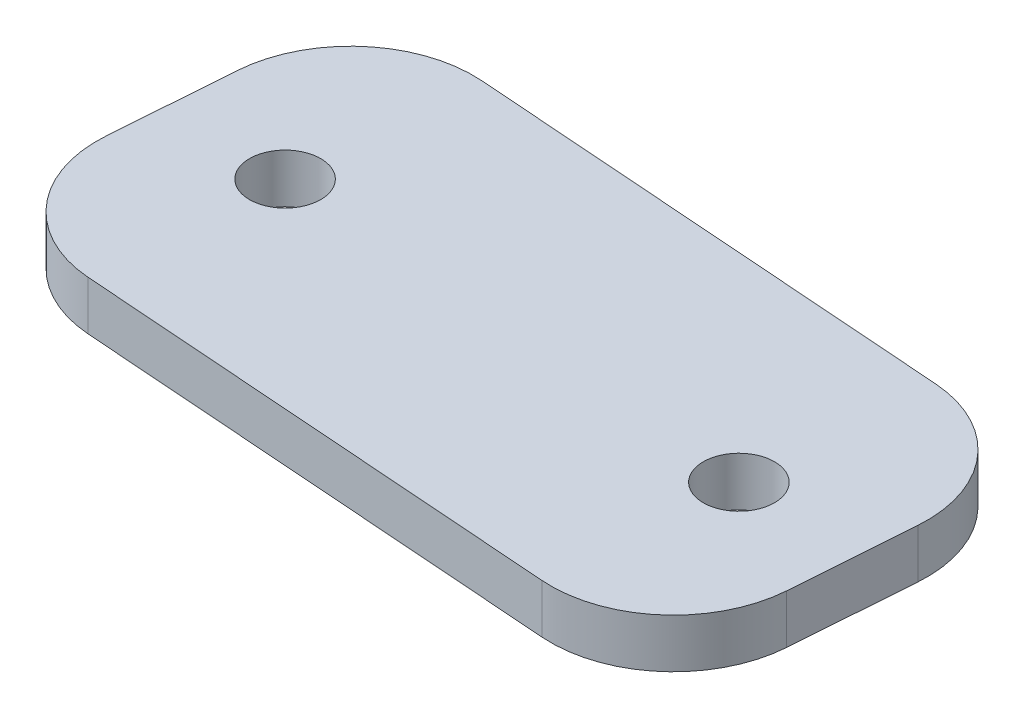
ISO-10303-21;
HEADER;
FILE_DESCRIPTION(('STEP AP214'),'2;1');
FILE_NAME('part.step','',(''),(''),'','','');
FILE_SCHEMA(('AUTOMOTIVE_DESIGN { 1 0 10303 214 1 1 1 1 }'));
ENDSEC;
DATA;
#1=APPLICATION_CONTEXT('core data for automotive mechanical design processes');
#2=APPLICATION_PROTOCOL_DEFINITION('international standard','automotive_design',2000,#1);
#3=PRODUCT_CONTEXT('',#1,'mechanical');
#4=PRODUCT('Part','Part','',(#3));
#5=PRODUCT_RELATED_PRODUCT_CATEGORY('part','',(#4));
#6=PRODUCT_DEFINITION_FORMATION('','',#4);
#7=PRODUCT_DEFINITION_CONTEXT('part definition',#1,'design');
#8=PRODUCT_DEFINITION('design','',#6,#7);
#9=PRODUCT_DEFINITION_SHAPE('','',#8);
#10=(LENGTH_UNIT() NAMED_UNIT(*) SI_UNIT(.MILLI.,.METRE.));
#11=(NAMED_UNIT(*) PLANE_ANGLE_UNIT() SI_UNIT($,.RADIAN.));
#12=(NAMED_UNIT(*) SI_UNIT($,.STERADIAN.) SOLID_ANGLE_UNIT());
#13=UNCERTAINTY_MEASURE_WITH_UNIT(LENGTH_MEASURE(1.E-05),#10,'distance_accuracy_value','');
#14=(GEOMETRIC_REPRESENTATION_CONTEXT(3) GLOBAL_UNCERTAINTY_ASSIGNED_CONTEXT((#13)) GLOBAL_UNIT_ASSIGNED_CONTEXT((#10,
#11,#12)) REPRESENTATION_CONTEXT('',''));
#15=CARTESIAN_POINT('',(0.,0.,0.));
#16=DIRECTION('',(0.,0.,1.));
#17=DIRECTION('',(1.,0.,0.));
#18=AXIS2_PLACEMENT_3D('',#15,#16,#17);
#19=CARTESIAN_POINT('',(0.,2.,0.));
#20=DIRECTION('',(0.,1.,0.));
#21=DIRECTION('',(0.,0.,1.));
#22=AXIS2_PLACEMENT_3D('',#19,#20,#21);
#23=PLANE('',#22);
#24=CARTESIAN_POINT('',(655.610626272258,2.,40.214384477411));
#25=DIRECTION('',(0.,1.,0.));
#26=DIRECTION('',(0.,0.,1.));
#27=AXIS2_PLACEMENT_3D('',#24,#25,#26);
#28=CIRCLE('',#27,1.45000000000006);
#29=CARTESIAN_POINT('',(655.610626272258,2.,41.664384477411));
#30=VERTEX_POINT('',#29);
#31=EDGE_CURVE('E186',#30,#30,#28,.T.);
#32=ORIENTED_EDGE('',*,*,#31,.F.);
#33=EDGE_LOOP('',(#32));
#34=FACE_BOUND('',#33,.T.);
#35=DIRECTION('',(-0.997359929598123,0.,-0.0726166016281925));
#36=VECTOR('',#35,1.);
#37=CARTESIAN_POINT('',(651.168451136479,2.,32.3711019972841));
#38=LINE('',#37,#36);
#39=CARTESIAN_POINT('',(676.102449376432,2.,34.1865170379889));
#40=VERTEX_POINT('',#39);
#41=CARTESIAN_POINT('',(656.15525078447,2.,32.734185005425));
#42=VERTEX_POINT('',#41);
#43=EDGE_CURVE('E177',#40,#42,#38,.T.);
#44=ORIENTED_EDGE('',*,*,#43,.T.);
#45=CARTESIAN_POINT('',(655.792167776329,2.,37.7209846534156));
#46=DIRECTION('',(0.,1.,0.));
#47=DIRECTION('',(0.,0.,1.));
#48=AXIS2_PLACEMENT_3D('',#45,#46,#47);
#49=CIRCLE('',#48,5.);
#50=CARTESIAN_POINT('',(650.805368128338,2.,37.3579016452747));
#51=VERTEX_POINT('',#50);
#52=EDGE_CURVE('E155',#42,#51,#49,.T.);
#53=ORIENTED_EDGE('',*,*,#52,.T.);
#54=DIRECTION('',(-0.0726166016281903,0.,0.997359929598123));
#55=VECTOR('',#54,1.);
#56=CARTESIAN_POINT('',(651.168451136479,2.,32.3711019972841));
#57=LINE('',#56,#55);
#58=CARTESIAN_POINT('',(650.442285120197,2.,42.3447012932655));
#59=VERTEX_POINT('',#58);
#60=EDGE_CURVE('E125',#51,#59,#57,.T.);
#61=ORIENTED_EDGE('',*,*,#60,.T.);
#62=CARTESIAN_POINT('',(655.429084768188,2.,42.7077843014064));
#63=DIRECTION('',(0.,1.,0.));
#64=DIRECTION('',(0.,0.,1.));
#65=AXIS2_PLACEMENT_3D('',#62,#63,#64);
#66=CIRCLE('',#65,5.);
#67=CARTESIAN_POINT('',(655.066001760047,2.,47.694583949397));
#68=VERTEX_POINT('',#67);
#69=EDGE_CURVE('E61',#59,#68,#66,.T.);
#70=ORIENTED_EDGE('',*,*,#69,.T.);
#71=DIRECTION('',(0.997359929598123,0.,0.0726166016281926));
#72=VECTOR('',#71,1.);
#73=CARTESIAN_POINT('',(650.079202112056,2.,47.3315009412561));
#74=LINE('',#73,#72);
#75=CARTESIAN_POINT('',(675.013200352009,2.,49.1469159819609));
#76=VERTEX_POINT('',#75);
#77=EDGE_CURVE('E141',#68,#76,#74,.T.);
#78=ORIENTED_EDGE('',*,*,#77,.T.);
#79=CARTESIAN_POINT('',(675.37628336015,2.,44.1601163339703));
#80=DIRECTION('',(0.,1.,0.));
#81=DIRECTION('',(0.,0.,1.));
#82=AXIS2_PLACEMENT_3D('',#79,#80,#81);
#83=CIRCLE('',#82,5.);
#84=CARTESIAN_POINT('',(680.363083008141,2.,44.5231993421113));
#85=VERTEX_POINT('',#84);
#86=EDGE_CURVE('E151',#76,#85,#83,.T.);
#87=ORIENTED_EDGE('',*,*,#86,.T.);
#88=DIRECTION('',(0.0726166016281977,0.,-0.997359929598122));
#89=VECTOR('',#88,1.);
#90=CARTESIAN_POINT('',(681.089249024423,2.,34.5496000461298));
#91=LINE('',#90,#89);
#92=CARTESIAN_POINT('',(680.726166016282,2.,39.5363996941205));
#93=VERTEX_POINT('',#92);
#94=EDGE_CURVE('E135',#85,#93,#91,.T.);
#95=ORIENTED_EDGE('',*,*,#94,.T.);
#96=CARTESIAN_POINT('',(675.739366368291,2.,39.1733166859795));
#97=DIRECTION('',(0.,1.,0.));
#98=DIRECTION('',(0.,0.,1.));
#99=AXIS2_PLACEMENT_3D('',#96,#97,#98);
#100=CIRCLE('',#99,5.);
#101=EDGE_CURVE('E153',#93,#40,#100,.T.);
#102=ORIENTED_EDGE('',*,*,#101,.T.);
#103=EDGE_LOOP('',(#44,#53,#61,#70,#78,#87,#95,#102));
#104=FACE_BOUND('',#103,.T.);
#105=CARTESIAN_POINT('',(675.557824864221,2.,41.6667165099748));
#106=DIRECTION('',(0.,1.,0.));
#107=DIRECTION('',(0.,0.,1.));
#108=AXIS2_PLACEMENT_3D('',#105,#106,#107);
#109=CIRCLE('',#108,1.44999999999962);
#110=CARTESIAN_POINT('',(675.557824864221,2.,43.1167165099745));
#111=VERTEX_POINT('',#110);
#112=EDGE_CURVE('E191',#111,#111,#109,.T.);
#113=ORIENTED_EDGE('',*,*,#112,.F.);
#114=EDGE_LOOP('',(#113));
#115=FACE_BOUND('',#114,.T.);
#116=ADVANCED_FACE('F41',(#34,#104,#115),#23,.T.);
#117=CARTESIAN_POINT('',(0.,0.,0.));
#118=DIRECTION('',(0.,1.,0.));
#119=DIRECTION('',(0.,0.,1.));
#120=AXIS2_PLACEMENT_3D('',#117,#118,#119);
#121=PLANE('',#120);
#122=DIRECTION('',(-0.0726166016281903,0.,0.997359929598123));
#123=VECTOR('',#122,1.);
#124=CARTESIAN_POINT('',(651.168451136479,0.,32.3711019972841));
#125=LINE('',#124,#123);
#126=CARTESIAN_POINT('',(650.805368128338,0.,37.3579016452747));
#127=VERTEX_POINT('',#126);
#128=CARTESIAN_POINT('',(650.442285120197,0.,42.3447012932655));
#129=VERTEX_POINT('',#128);
#130=EDGE_CURVE('E123',#127,#129,#125,.T.);
#131=ORIENTED_EDGE('',*,*,#130,.F.);
#132=CARTESIAN_POINT('',(655.792167776329,0.,37.7209846534156));
#133=DIRECTION('',(0.,1.,0.));
#134=DIRECTION('',(0.,0.,1.));
#135=AXIS2_PLACEMENT_3D('',#132,#133,#134);
#136=CIRCLE('',#135,5.);
#137=CARTESIAN_POINT('',(656.15525078447,0.,32.734185005425));
#138=VERTEX_POINT('',#137);
#139=EDGE_CURVE('E106',#127,#138,#136,.F.);
#140=ORIENTED_EDGE('',*,*,#139,.T.);
#141=DIRECTION('',(-0.997359929598123,0.,-0.0726166016281925));
#142=VECTOR('',#141,1.);
#143=CARTESIAN_POINT('',(651.168451136479,0.,32.3711019972841));
#144=LINE('',#143,#142);
#145=CARTESIAN_POINT('',(676.102449376432,0.,34.1865170379889));
#146=VERTEX_POINT('',#145);
#147=EDGE_CURVE('E133',#146,#138,#144,.T.);
#148=ORIENTED_EDGE('',*,*,#147,.F.);
#149=CARTESIAN_POINT('',(675.739366368291,0.,39.1733166859795));
#150=DIRECTION('',(0.,1.,0.));
#151=DIRECTION('',(0.,0.,1.));
#152=AXIS2_PLACEMENT_3D('',#149,#150,#151);
#153=CIRCLE('',#152,5.);
#154=CARTESIAN_POINT('',(680.726166016282,0.,39.5363996941205));
#155=VERTEX_POINT('',#154);
#156=EDGE_CURVE('E117',#146,#155,#153,.F.);
#157=ORIENTED_EDGE('',*,*,#156,.T.);
#158=DIRECTION('',(0.0726166016281977,0.,-0.997359929598122));
#159=VECTOR('',#158,1.);
#160=CARTESIAN_POINT('',(681.089249024423,0.,34.5496000461298));
#161=LINE('',#160,#159);
#162=CARTESIAN_POINT('',(680.363083008141,0.,44.5231993421113));
#163=VERTEX_POINT('',#162);
#164=EDGE_CURVE('E137',#163,#155,#161,.T.);
#165=ORIENTED_EDGE('',*,*,#164,.F.);
#166=CARTESIAN_POINT('',(675.37628336015,0.,44.1601163339703));
#167=DIRECTION('',(0.,1.,0.));
#168=DIRECTION('',(0.,0.,1.));
#169=AXIS2_PLACEMENT_3D('',#166,#167,#168);
#170=CIRCLE('',#169,5.);
#171=CARTESIAN_POINT('',(675.013200352009,0.,49.1469159819609));
#172=VERTEX_POINT('',#171);
#173=EDGE_CURVE('E144',#163,#172,#170,.F.);
#174=ORIENTED_EDGE('',*,*,#173,.T.);
#175=DIRECTION('',(0.997359929598123,0.,0.0726166016281926));
#176=VECTOR('',#175,1.);
#177=CARTESIAN_POINT('',(650.079202112056,0.,47.3315009412561));
#178=LINE('',#177,#176);
#179=CARTESIAN_POINT('',(655.066001760047,0.,47.694583949397));
#180=VERTEX_POINT('',#179);
#181=EDGE_CURVE('E132',#180,#172,#178,.T.);
#182=ORIENTED_EDGE('',*,*,#181,.F.);
#183=CARTESIAN_POINT('',(655.429084768188,0.,42.7077843014064));
#184=DIRECTION('',(0.,1.,0.));
#185=DIRECTION('',(0.,0.,1.));
#186=AXIS2_PLACEMENT_3D('',#183,#184,#185);
#187=CIRCLE('',#186,5.);
#188=EDGE_CURVE('E126',#180,#129,#187,.F.);
#189=ORIENTED_EDGE('',*,*,#188,.T.);
#190=EDGE_LOOP('',(#131,#140,#148,#157,#165,#174,#182,#189));
#191=FACE_BOUND('',#190,.T.);
#192=CARTESIAN_POINT('',(655.610626272258,0.,40.214384477411));
#193=DIRECTION('',(0.,1.,0.));
#194=DIRECTION('',(0.,0.,1.));
#195=AXIS2_PLACEMENT_3D('',#192,#193,#194);
#196=CIRCLE('',#195,1.45000000000006);
#197=CARTESIAN_POINT('',(655.610626272258,0.,41.664384477411));
#198=VERTEX_POINT('',#197);
#199=EDGE_CURVE('E182',#198,#198,#196,.T.);
#200=ORIENTED_EDGE('',*,*,#199,.T.);
#201=EDGE_LOOP('',(#200));
#202=FACE_BOUND('',#201,.T.);
#203=CARTESIAN_POINT('',(675.557824864221,0.,41.6667165099748));
#204=DIRECTION('',(0.,1.,0.));
#205=DIRECTION('',(0.,0.,1.));
#206=AXIS2_PLACEMENT_3D('',#203,#204,#205);
#207=CIRCLE('',#206,1.44999999999962);
#208=CARTESIAN_POINT('',(675.557824864221,0.,43.1167165099745));
#209=VERTEX_POINT('',#208);
#210=EDGE_CURVE('E193',#209,#209,#207,.T.);
#211=ORIENTED_EDGE('',*,*,#210,.T.);
#212=EDGE_LOOP('',(#211));
#213=FACE_BOUND('',#212,.T.);
#214=ADVANCED_FACE('F129',(#191,#202,#213),#121,.F.);
#215=CARTESIAN_POINT('',(681.089249024423,2.,34.5496000461298));
#216=DIRECTION('',(-0.997359929598122,0.,-0.0726166016281977));
#217=DIRECTION('',(-0.0726166016281977,0.,0.997359929598122));
#218=AXIS2_PLACEMENT_3D('',#215,#216,#217);
#219=PLANE('',#218);
#220=ORIENTED_EDGE('',*,*,#164,.T.);
#221=DIRECTION('',(0.,-1.,0.));
#222=VECTOR('',#221,1.);
#223=CARTESIAN_POINT('',(680.726166016282,2.,39.5363996941205));
#224=LINE('',#223,#222);
#225=EDGE_CURVE('E160',#155,#93,#224,.F.);
#226=ORIENTED_EDGE('',*,*,#225,.T.);
#227=ORIENTED_EDGE('',*,*,#94,.F.);
#228=DIRECTION('',(0.,-1.,0.));
#229=VECTOR('',#228,1.);
#230=CARTESIAN_POINT('',(680.363083008141,2.,44.5231993421113));
#231=LINE('',#230,#229);
#232=EDGE_CURVE('E157',#85,#163,#231,.T.);
#233=ORIENTED_EDGE('',*,*,#232,.T.);
#234=EDGE_LOOP('',(#220,#226,#227,#233));
#235=FACE_BOUND('',#234,.T.);
#236=ADVANCED_FACE('F173',(#235),#219,.F.);
#237=CARTESIAN_POINT('',(651.168451136479,2.,32.3711019972841));
#238=DIRECTION('',(-0.0726166016281925,0.,0.997359929598123));
#239=DIRECTION('',(0.997359929598123,0.,0.0726166016281925));
#240=AXIS2_PLACEMENT_3D('',#237,#238,#239);
#241=PLANE('',#240);
#242=ORIENTED_EDGE('',*,*,#147,.T.);
#243=DIRECTION('',(0.,-1.,0.));
#244=VECTOR('',#243,1.);
#245=CARTESIAN_POINT('',(656.15525078447,2.,32.734185005425));
#246=LINE('',#245,#244);
#247=EDGE_CURVE('E111',#138,#42,#246,.F.);
#248=ORIENTED_EDGE('',*,*,#247,.T.);
#249=ORIENTED_EDGE('',*,*,#43,.F.);
#250=DIRECTION('',(0.,-1.,0.));
#251=VECTOR('',#250,1.);
#252=CARTESIAN_POINT('',(676.102449376432,2.,34.1865170379889));
#253=LINE('',#252,#251);
#254=EDGE_CURVE('E116',#40,#146,#253,.T.);
#255=ORIENTED_EDGE('',*,*,#254,.T.);
#256=EDGE_LOOP('',(#242,#248,#249,#255));
#257=FACE_BOUND('',#256,.T.);
#258=ADVANCED_FACE('F218',(#257),#241,.F.);
#259=CARTESIAN_POINT('',(651.168451136479,2.,32.3711019972841));
#260=DIRECTION('',(0.997359929598123,0.,0.0726166016281903));
#261=DIRECTION('',(0.0726166016281903,0.,-0.997359929598123));
#262=AXIS2_PLACEMENT_3D('',#259,#260,#261);
#263=PLANE('',#262);
#264=ORIENTED_EDGE('',*,*,#60,.F.);
#265=DIRECTION('',(0.,-1.,0.));
#266=VECTOR('',#265,1.);
#267=CARTESIAN_POINT('',(650.805368128338,2.,37.3579016452747));
#268=LINE('',#267,#266);
#269=EDGE_CURVE('E110',#51,#127,#268,.T.);
#270=ORIENTED_EDGE('',*,*,#269,.T.);
#271=ORIENTED_EDGE('',*,*,#130,.T.);
#272=DIRECTION('',(0.,-1.,0.));
#273=VECTOR('',#272,1.);
#274=CARTESIAN_POINT('',(650.442285120197,2.,42.3447012932655));
#275=LINE('',#274,#273);
#276=EDGE_CURVE('E127',#129,#59,#275,.F.);
#277=ORIENTED_EDGE('',*,*,#276,.T.);
#278=EDGE_LOOP('',(#264,#270,#271,#277));
#279=FACE_BOUND('',#278,.T.);
#280=ADVANCED_FACE('F122',(#279),#263,.F.);
#281=CARTESIAN_POINT('',(650.079202112056,2.,47.3315009412561));
#282=DIRECTION('',(0.0726166016281926,0.,-0.997359929598123));
#283=DIRECTION('',(-0.997359929598123,0.,-0.0726166016281926));
#284=AXIS2_PLACEMENT_3D('',#281,#282,#283);
#285=PLANE('',#284);
#286=ORIENTED_EDGE('',*,*,#181,.T.);
#287=DIRECTION('',(0.,-1.,0.));
#288=VECTOR('',#287,1.);
#289=CARTESIAN_POINT('',(675.013200352009,2.,49.1469159819609));
#290=LINE('',#289,#288);
#291=EDGE_CURVE('E11',#172,#76,#290,.F.);
#292=ORIENTED_EDGE('',*,*,#291,.T.);
#293=ORIENTED_EDGE('',*,*,#77,.F.);
#294=DIRECTION('',(0.,-1.,0.));
#295=VECTOR('',#294,1.);
#296=CARTESIAN_POINT('',(655.066001760047,2.,47.694583949397));
#297=LINE('',#296,#295);
#298=EDGE_CURVE('E49',#68,#180,#297,.T.);
#299=ORIENTED_EDGE('',*,*,#298,.T.);
#300=EDGE_LOOP('',(#286,#292,#293,#299));
#301=FACE_BOUND('',#300,.T.);
#302=ADVANCED_FACE('F163',(#301),#285,.F.);
#303=CARTESIAN_POINT('',(655.610626272258,2.,40.214384477411));
#304=DIRECTION('',(0.,-1.,0.));
#305=DIRECTION('',(0.,0.,-1.));
#306=AXIS2_PLACEMENT_3D('',#303,#304,#305);
#307=CYLINDRICAL_SURFACE('',#306,1.45000000000006);
#308=ORIENTED_EDGE('',*,*,#31,.T.);
#309=EDGE_LOOP('',(#308));
#310=FACE_BOUND('',#309,.T.);
#311=ORIENTED_EDGE('',*,*,#199,.F.);
#312=EDGE_LOOP('',(#311));
#313=FACE_BOUND('',#312,.T.);
#314=ADVANCED_FACE('F211',(#310,#313),#307,.F.);
#315=CARTESIAN_POINT('',(675.557824864221,2.,41.6667165099748));
#316=DIRECTION('',(0.,-1.,0.));
#317=DIRECTION('',(0.,0.,-1.));
#318=AXIS2_PLACEMENT_3D('',#315,#316,#317);
#319=CYLINDRICAL_SURFACE('',#318,1.44999999999962);
#320=ORIENTED_EDGE('',*,*,#112,.T.);
#321=EDGE_LOOP('',(#320));
#322=FACE_BOUND('',#321,.T.);
#323=ORIENTED_EDGE('',*,*,#210,.F.);
#324=EDGE_LOOP('',(#323));
#325=FACE_BOUND('',#324,.T.);
#326=ADVANCED_FACE('F199',(#322,#325),#319,.F.);
#327=CARTESIAN_POINT('',(655.792167776329,2.,37.7209846534156));
#328=DIRECTION('',(0.,-1.,0.));
#329=DIRECTION('',(0.,0.,-1.));
#330=AXIS2_PLACEMENT_3D('',#327,#328,#329);
#331=CYLINDRICAL_SURFACE('',#330,5.);
#332=ORIENTED_EDGE('',*,*,#52,.F.);
#333=ORIENTED_EDGE('',*,*,#247,.F.);
#334=ORIENTED_EDGE('',*,*,#139,.F.);
#335=ORIENTED_EDGE('',*,*,#269,.F.);
#336=EDGE_LOOP('',(#332,#333,#334,#335));
#337=FACE_BOUND('',#336,.T.);
#338=ADVANCED_FACE('F109',(#337),#331,.T.);
#339=CARTESIAN_POINT('',(675.739366368291,2.,39.1733166859795));
#340=DIRECTION('',(0.,-1.,0.));
#341=DIRECTION('',(0.,0.,-1.));
#342=AXIS2_PLACEMENT_3D('',#339,#340,#341);
#343=CYLINDRICAL_SURFACE('',#342,5.);
#344=ORIENTED_EDGE('',*,*,#101,.F.);
#345=ORIENTED_EDGE('',*,*,#225,.F.);
#346=ORIENTED_EDGE('',*,*,#156,.F.);
#347=ORIENTED_EDGE('',*,*,#254,.F.);
#348=EDGE_LOOP('',(#344,#345,#346,#347));
#349=FACE_BOUND('',#348,.T.);
#350=ADVANCED_FACE('F226',(#349),#343,.T.);
#351=CARTESIAN_POINT('',(675.37628336015,2.,44.1601163339703));
#352=DIRECTION('',(0.,-1.,0.));
#353=DIRECTION('',(0.,0.,-1.));
#354=AXIS2_PLACEMENT_3D('',#351,#352,#353);
#355=CYLINDRICAL_SURFACE('',#354,5.);
#356=ORIENTED_EDGE('',*,*,#86,.F.);
#357=ORIENTED_EDGE('',*,*,#291,.F.);
#358=ORIENTED_EDGE('',*,*,#173,.F.);
#359=ORIENTED_EDGE('',*,*,#232,.F.);
#360=EDGE_LOOP('',(#356,#357,#358,#359));
#361=FACE_BOUND('',#360,.T.);
#362=ADVANCED_FACE('F170',(#361),#355,.T.);
#363=CARTESIAN_POINT('',(655.429084768188,2.,42.7077843014064));
#364=DIRECTION('',(0.,-1.,0.));
#365=DIRECTION('',(0.,0.,-1.));
#366=AXIS2_PLACEMENT_3D('',#363,#364,#365);
#367=CYLINDRICAL_SURFACE('',#366,5.);
#368=ORIENTED_EDGE('',*,*,#69,.F.);
#369=ORIENTED_EDGE('',*,*,#276,.F.);
#370=ORIENTED_EDGE('',*,*,#188,.F.);
#371=ORIENTED_EDGE('',*,*,#298,.F.);
#372=EDGE_LOOP('',(#368,#369,#370,#371));
#373=FACE_BOUND('',#372,.T.);
#374=ADVANCED_FACE('F43',(#373),#367,.T.);
#375=CLOSED_SHELL('',(#116,#214,#236,#258,#280,#302,#314,#326,#338,#350,#362,#374));
#376=MANIFOLD_SOLID_BREP('B2',#375);
#377=ADVANCED_BREP_SHAPE_REPRESENTATION('',(#18,#376),#14);
#378=SHAPE_DEFINITION_REPRESENTATION(#9,#377);
ENDSEC;
END-ISO-10303-21;
